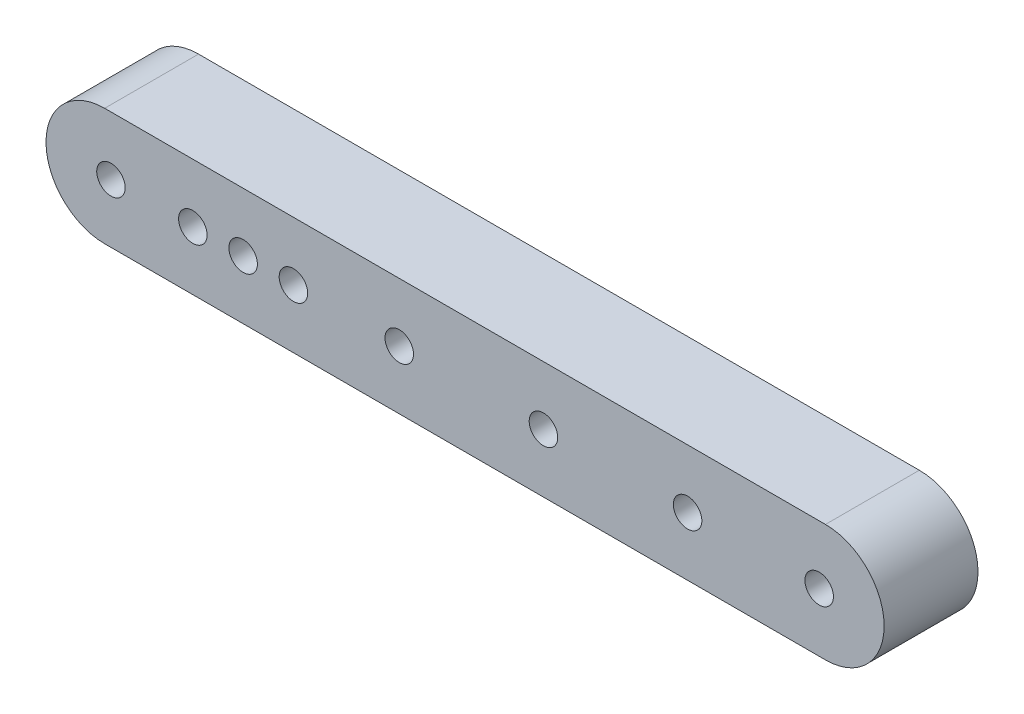
ISO-10303-21;
HEADER;
FILE_DESCRIPTION(('STEP AP214'),'2;1');
FILE_NAME('part.step','',(''),(''),'','','');
FILE_SCHEMA(('AUTOMOTIVE_DESIGN { 1 0 10303 214 1 1 1 1 }'));
ENDSEC;
DATA;
#1=APPLICATION_CONTEXT('core data for automotive mechanical design processes');
#2=APPLICATION_PROTOCOL_DEFINITION('international standard','automotive_design',2000,#1);
#3=PRODUCT_CONTEXT('',#1,'mechanical');
#4=PRODUCT('Part','Part','',(#3));
#5=PRODUCT_RELATED_PRODUCT_CATEGORY('part','',(#4));
#6=PRODUCT_DEFINITION_FORMATION('','',#4);
#7=PRODUCT_DEFINITION_CONTEXT('part definition',#1,'design');
#8=PRODUCT_DEFINITION('design','',#6,#7);
#9=PRODUCT_DEFINITION_SHAPE('','',#8);
#10=(LENGTH_UNIT() NAMED_UNIT(*) SI_UNIT(.MILLI.,.METRE.));
#11=(NAMED_UNIT(*) PLANE_ANGLE_UNIT() SI_UNIT($,.RADIAN.));
#12=(NAMED_UNIT(*) SI_UNIT($,.STERADIAN.) SOLID_ANGLE_UNIT());
#13=UNCERTAINTY_MEASURE_WITH_UNIT(LENGTH_MEASURE(1.E-05),#10,'distance_accuracy_value','');
#14=(GEOMETRIC_REPRESENTATION_CONTEXT(3) GLOBAL_UNCERTAINTY_ASSIGNED_CONTEXT((#13)) GLOBAL_UNIT_ASSIGNED_CONTEXT((#10,
#11,#12)) REPRESENTATION_CONTEXT('',''));
#15=CARTESIAN_POINT('',(0.,0.,0.));
#16=DIRECTION('',(0.,0.,1.));
#17=DIRECTION('',(1.,0.,0.));
#18=AXIS2_PLACEMENT_3D('',#15,#16,#17);
#19=CARTESIAN_POINT('',(-54.8096085409253,0.,-5.6));
#20=DIRECTION('',(0.,0.,1.));
#21=DIRECTION('',(1.,0.,0.));
#22=AXIS2_PLACEMENT_3D('',#19,#20,#21);
#23=CYLINDRICAL_SURFACE('',#22,7.);
#24=DIRECTION('',(0.,0.,1.));
#25=VECTOR('',#24,1.);
#26=CARTESIAN_POINT('',(-54.8096085409253,-7.,-5.6));
#27=LINE('',#26,#25);
#28=CARTESIAN_POINT('',(-54.8096085409253,-7.,-5.6));
#29=VERTEX_POINT('',#28);
#30=CARTESIAN_POINT('',(-54.8096085409253,-7.,5.6));
#31=VERTEX_POINT('',#30);
#32=EDGE_CURVE('E42',#29,#31,#27,.T.);
#33=ORIENTED_EDGE('',*,*,#32,.T.);
#34=CARTESIAN_POINT('',(-54.8096085409253,0.,5.6));
#35=DIRECTION('',(0.,0.,1.));
#36=DIRECTION('',(1.,0.,0.));
#37=AXIS2_PLACEMENT_3D('',#34,#35,#36);
#38=CIRCLE('',#37,7.);
#39=CARTESIAN_POINT('',(-54.8096085409253,7.,5.6));
#40=VERTEX_POINT('',#39);
#41=EDGE_CURVE('E80',#40,#31,#38,.T.);
#42=ORIENTED_EDGE('',*,*,#41,.F.);
#43=DIRECTION('',(0.,0.,1.));
#44=VECTOR('',#43,1.);
#45=CARTESIAN_POINT('',(-54.8096085409253,7.,-5.6));
#46=LINE('',#45,#44);
#47=CARTESIAN_POINT('',(-54.8096085409253,7.,-5.6));
#48=VERTEX_POINT('',#47);
#49=EDGE_CURVE('E11',#48,#40,#46,.T.);
#50=ORIENTED_EDGE('',*,*,#49,.F.);
#51=CARTESIAN_POINT('',(-54.8096085409253,0.,-5.6));
#52=DIRECTION('',(0.,0.,1.));
#53=DIRECTION('',(1.,0.,0.));
#54=AXIS2_PLACEMENT_3D('',#51,#52,#53);
#55=CIRCLE('',#54,7.);
#56=EDGE_CURVE('E81',#48,#29,#55,.T.);
#57=ORIENTED_EDGE('',*,*,#56,.T.);
#58=EDGE_LOOP('',(#33,#42,#50,#57));
#59=FACE_BOUND('',#58,.T.);
#60=ADVANCED_FACE('F39',(#59),#23,.T.);
#61=CARTESIAN_POINT('',(-54.8096085409253,7.,-5.6));
#62=DIRECTION('',(0.,1.,0.));
#63=DIRECTION('',(0.,0.,1.));
#64=AXIS2_PLACEMENT_3D('',#61,#62,#63);
#65=PLANE('',#64);
#66=ORIENTED_EDGE('',*,*,#49,.T.);
#67=DIRECTION('',(-1.,0.,0.));
#68=VECTOR('',#67,1.);
#69=CARTESIAN_POINT('',(-54.8096085409253,7.,5.6));
#70=LINE('',#69,#68);
#71=CARTESIAN_POINT('',(31.1903914590747,7.,5.6));
#72=VERTEX_POINT('',#71);
#73=EDGE_CURVE('E99',#72,#40,#70,.T.);
#74=ORIENTED_EDGE('',*,*,#73,.F.);
#75=DIRECTION('',(0.,0.,1.));
#76=VECTOR('',#75,1.);
#77=CARTESIAN_POINT('',(31.1903914590747,7.,-5.6));
#78=LINE('',#77,#76);
#79=CARTESIAN_POINT('',(31.1903914590747,7.,-5.6));
#80=VERTEX_POINT('',#79);
#81=EDGE_CURVE('E48',#80,#72,#78,.T.);
#82=ORIENTED_EDGE('',*,*,#81,.F.);
#83=DIRECTION('',(-1.,0.,0.));
#84=VECTOR('',#83,1.);
#85=CARTESIAN_POINT('',(-54.8096085409253,7.,-5.6));
#86=LINE('',#85,#84);
#87=EDGE_CURVE('E87',#80,#48,#86,.T.);
#88=ORIENTED_EDGE('',*,*,#87,.T.);
#89=EDGE_LOOP('',(#66,#74,#82,#88));
#90=FACE_BOUND('',#89,.T.);
#91=ADVANCED_FACE('F131',(#90),#65,.T.);
#92=CARTESIAN_POINT('',(31.1903914590747,0.,-5.6));
#93=DIRECTION('',(0.,0.,1.));
#94=DIRECTION('',(1.,0.,0.));
#95=AXIS2_PLACEMENT_3D('',#92,#93,#94);
#96=CYLINDRICAL_SURFACE('',#95,7.);
#97=ORIENTED_EDGE('',*,*,#81,.T.);
#98=CARTESIAN_POINT('',(31.1903914590747,0.,5.6));
#99=DIRECTION('',(0.,0.,1.));
#100=DIRECTION('',(1.,0.,0.));
#101=AXIS2_PLACEMENT_3D('',#98,#99,#100);
#102=CIRCLE('',#101,7.);
#103=CARTESIAN_POINT('',(31.1903914590747,-7.,5.6));
#104=VERTEX_POINT('',#103);
#105=EDGE_CURVE('E95',#104,#72,#102,.T.);
#106=ORIENTED_EDGE('',*,*,#105,.F.);
#107=DIRECTION('',(0.,0.,1.));
#108=VECTOR('',#107,1.);
#109=CARTESIAN_POINT('',(31.1903914590747,-7.,-5.6));
#110=LINE('',#109,#108);
#111=CARTESIAN_POINT('',(31.1903914590747,-7.,-5.6));
#112=VERTEX_POINT('',#111);
#113=EDGE_CURVE('E86',#112,#104,#110,.T.);
#114=ORIENTED_EDGE('',*,*,#113,.F.);
#115=CARTESIAN_POINT('',(31.1903914590747,0.,-5.6));
#116=DIRECTION('',(0.,0.,1.));
#117=DIRECTION('',(1.,0.,0.));
#118=AXIS2_PLACEMENT_3D('',#115,#116,#117);
#119=CIRCLE('',#118,7.);
#120=EDGE_CURVE('E120',#112,#80,#119,.T.);
#121=ORIENTED_EDGE('',*,*,#120,.T.);
#122=EDGE_LOOP('',(#97,#106,#114,#121));
#123=FACE_BOUND('',#122,.T.);
#124=ADVANCED_FACE('F128',(#123),#96,.T.);
#125=CARTESIAN_POINT('',(-54.8096085409253,-7.,-5.6));
#126=DIRECTION('',(0.,-1.,0.));
#127=DIRECTION('',(0.,0.,-1.));
#128=AXIS2_PLACEMENT_3D('',#125,#126,#127);
#129=PLANE('',#128);
#130=ORIENTED_EDGE('',*,*,#113,.T.);
#131=DIRECTION('',(1.,0.,0.));
#132=VECTOR('',#131,1.);
#133=CARTESIAN_POINT('',(-54.8096085409253,-7.,5.6));
#134=LINE('',#133,#132);
#135=EDGE_CURVE('E89',#31,#104,#134,.T.);
#136=ORIENTED_EDGE('',*,*,#135,.F.);
#137=ORIENTED_EDGE('',*,*,#32,.F.);
#138=DIRECTION('',(1.,0.,0.));
#139=VECTOR('',#138,1.);
#140=CARTESIAN_POINT('',(-54.8096085409253,-7.,-5.6));
#141=LINE('',#140,#139);
#142=EDGE_CURVE('E117',#29,#112,#141,.T.);
#143=ORIENTED_EDGE('',*,*,#142,.T.);
#144=EDGE_LOOP('',(#130,#136,#137,#143));
#145=FACE_BOUND('',#144,.T.);
#146=ADVANCED_FACE('F90',(#145),#129,.T.);
#147=CARTESIAN_POINT('',(-54.8096085409253,0.,-5.6));
#148=DIRECTION('',(0.,0.,1.));
#149=DIRECTION('',(1.,0.,0.));
#150=AXIS2_PLACEMENT_3D('',#147,#148,#149);
#151=PLANE('',#150);
#152=CARTESIAN_POINT('',(-54.0596085409253,0.,-5.6));
#153=DIRECTION('',(0.,0.,1.));
#154=DIRECTION('',(1.,0.,0.));
#155=AXIS2_PLACEMENT_3D('',#152,#153,#154);
#156=CIRCLE('',#155,1.7);
#157=CARTESIAN_POINT('',(-52.3596085409253,0.,-5.6));
#158=VERTEX_POINT('',#157);
#159=EDGE_CURVE('E105',#158,#158,#156,.T.);
#160=ORIENTED_EDGE('',*,*,#159,.T.);
#161=EDGE_LOOP('',(#160));
#162=FACE_BOUND('',#161,.T.);
#163=CARTESIAN_POINT('',(-19.6596085409253,0.,-5.6));
#164=DIRECTION('',(0.,0.,1.));
#165=DIRECTION('',(1.,0.,0.));
#166=AXIS2_PLACEMENT_3D('',#163,#164,#165);
#167=CIRCLE('',#166,1.7);
#168=CARTESIAN_POINT('',(-17.9596085409253,0.,-5.6));
#169=VERTEX_POINT('',#168);
#170=EDGE_CURVE('E301',#169,#169,#167,.T.);
#171=ORIENTED_EDGE('',*,*,#170,.T.);
#172=EDGE_LOOP('',(#171));
#173=FACE_BOUND('',#172,.T.);
#174=CARTESIAN_POINT('',(-44.2896085409253,0.,-5.6));
#175=DIRECTION('',(0.,0.,1.));
#176=DIRECTION('',(1.,0.,0.));
#177=AXIS2_PLACEMENT_3D('',#174,#175,#176);
#178=CIRCLE('',#177,1.7);
#179=CARTESIAN_POINT('',(-42.5896085409253,0.,-5.6));
#180=VERTEX_POINT('',#179);
#181=EDGE_CURVE('E319',#180,#180,#178,.T.);
#182=ORIENTED_EDGE('',*,*,#181,.T.);
#183=EDGE_LOOP('',(#182));
#184=FACE_BOUND('',#183,.T.);
#185=CARTESIAN_POINT('',(-32.2896085409253,0.,-5.6));
#186=DIRECTION('',(0.,0.,1.));
#187=DIRECTION('',(1.,0.,0.));
#188=AXIS2_PLACEMENT_3D('',#185,#186,#187);
#189=CIRCLE('',#188,1.7);
#190=CARTESIAN_POINT('',(-30.5896085409253,0.,-5.6));
#191=VERTEX_POINT('',#190);
#192=EDGE_CURVE('E308',#191,#191,#189,.T.);
#193=ORIENTED_EDGE('',*,*,#192,.T.);
#194=EDGE_LOOP('',(#193));
#195=FACE_BOUND('',#194,.T.);
#196=CARTESIAN_POINT('',(-38.2896085409253,0.,-5.6));
#197=DIRECTION('',(0.,0.,1.));
#198=DIRECTION('',(1.,0.,0.));
#199=AXIS2_PLACEMENT_3D('',#196,#197,#198);
#200=CIRCLE('',#199,1.7);
#201=CARTESIAN_POINT('',(-36.5896085409253,0.,-5.6));
#202=VERTEX_POINT('',#201);
#203=EDGE_CURVE('E307',#202,#202,#200,.T.);
#204=ORIENTED_EDGE('',*,*,#203,.T.);
#205=EDGE_LOOP('',(#204));
#206=FACE_BOUND('',#205,.T.);
#207=CARTESIAN_POINT('',(-2.45960854092527,0.,-5.6));
#208=DIRECTION('',(0.,0.,1.));
#209=DIRECTION('',(1.,0.,0.));
#210=AXIS2_PLACEMENT_3D('',#207,#208,#209);
#211=CIRCLE('',#210,1.7);
#212=CARTESIAN_POINT('',(-0.759608540925272,0.,-5.6));
#213=VERTEX_POINT('',#212);
#214=EDGE_CURVE('E297',#213,#213,#211,.T.);
#215=ORIENTED_EDGE('',*,*,#214,.T.);
#216=EDGE_LOOP('',(#215));
#217=FACE_BOUND('',#216,.T.);
#218=CARTESIAN_POINT('',(14.7403914590747,0.,-5.6));
#219=DIRECTION('',(0.,0.,1.));
#220=DIRECTION('',(1.,0.,0.));
#221=AXIS2_PLACEMENT_3D('',#218,#219,#220);
#222=CIRCLE('',#221,1.7);
#223=CARTESIAN_POINT('',(16.4403914590747,0.,-5.6));
#224=VERTEX_POINT('',#223);
#225=EDGE_CURVE('E286',#224,#224,#222,.T.);
#226=ORIENTED_EDGE('',*,*,#225,.T.);
#227=EDGE_LOOP('',(#226));
#228=FACE_BOUND('',#227,.T.);
#229=CARTESIAN_POINT('',(30.4403914590747,0.,-5.6));
#230=DIRECTION('',(0.,0.,1.));
#231=DIRECTION('',(1.,0.,0.));
#232=AXIS2_PLACEMENT_3D('',#229,#230,#231);
#233=CIRCLE('',#232,1.7);
#234=CARTESIAN_POINT('',(32.1403914590747,0.,-5.6));
#235=VERTEX_POINT('',#234);
#236=EDGE_CURVE('E287',#235,#235,#233,.T.);
#237=ORIENTED_EDGE('',*,*,#236,.T.);
#238=EDGE_LOOP('',(#237));
#239=FACE_BOUND('',#238,.T.);
#240=ORIENTED_EDGE('',*,*,#56,.F.);
#241=ORIENTED_EDGE('',*,*,#87,.F.);
#242=ORIENTED_EDGE('',*,*,#120,.F.);
#243=ORIENTED_EDGE('',*,*,#142,.F.);
#244=EDGE_LOOP('',(#240,#241,#242,#243));
#245=FACE_BOUND('',#244,.T.);
#246=ADVANCED_FACE('F133',(#162,#173,#184,#195,#206,#217,#228,#239,#245),#151,.F.);
#247=CARTESIAN_POINT('',(-54.8096085409253,0.,5.6));
#248=DIRECTION('',(0.,0.,1.));
#249=DIRECTION('',(1.,0.,0.));
#250=AXIS2_PLACEMENT_3D('',#247,#248,#249);
#251=PLANE('',#250);
#252=CARTESIAN_POINT('',(-54.0596085409253,0.,5.6));
#253=DIRECTION('',(0.,0.,1.));
#254=DIRECTION('',(1.,0.,0.));
#255=AXIS2_PLACEMENT_3D('',#252,#253,#254);
#256=CIRCLE('',#255,1.7);
#257=CARTESIAN_POINT('',(-52.3596085409253,0.,5.6));
#258=VERTEX_POINT('',#257);
#259=EDGE_CURVE('E101',#258,#258,#256,.T.);
#260=ORIENTED_EDGE('',*,*,#259,.F.);
#261=EDGE_LOOP('',(#260));
#262=FACE_BOUND('',#261,.T.);
#263=CARTESIAN_POINT('',(-19.6596085409253,0.,5.6));
#264=DIRECTION('',(0.,0.,1.));
#265=DIRECTION('',(1.,0.,0.));
#266=AXIS2_PLACEMENT_3D('',#263,#264,#265);
#267=CIRCLE('',#266,1.7);
#268=CARTESIAN_POINT('',(-17.9596085409253,0.,5.6));
#269=VERTEX_POINT('',#268);
#270=EDGE_CURVE('E261',#269,#269,#267,.T.);
#271=ORIENTED_EDGE('',*,*,#270,.F.);
#272=EDGE_LOOP('',(#271));
#273=FACE_BOUND('',#272,.T.);
#274=CARTESIAN_POINT('',(-44.2896085409253,0.,5.6));
#275=DIRECTION('',(0.,0.,1.));
#276=DIRECTION('',(1.,0.,0.));
#277=AXIS2_PLACEMENT_3D('',#274,#275,#276);
#278=CIRCLE('',#277,1.7);
#279=CARTESIAN_POINT('',(-42.5896085409253,0.,5.6));
#280=VERTEX_POINT('',#279);
#281=EDGE_CURVE('E265',#280,#280,#278,.T.);
#282=ORIENTED_EDGE('',*,*,#281,.F.);
#283=EDGE_LOOP('',(#282));
#284=FACE_BOUND('',#283,.T.);
#285=CARTESIAN_POINT('',(-32.2896085409253,0.,5.6));
#286=DIRECTION('',(0.,0.,1.));
#287=DIRECTION('',(1.,0.,0.));
#288=AXIS2_PLACEMENT_3D('',#285,#286,#287);
#289=CIRCLE('',#288,1.7);
#290=CARTESIAN_POINT('',(-30.5896085409253,0.,5.6));
#291=VERTEX_POINT('',#290);
#292=EDGE_CURVE('E269',#291,#291,#289,.T.);
#293=ORIENTED_EDGE('',*,*,#292,.F.);
#294=EDGE_LOOP('',(#293));
#295=FACE_BOUND('',#294,.T.);
#296=CARTESIAN_POINT('',(-38.2896085409253,0.,5.6));
#297=DIRECTION('',(0.,0.,1.));
#298=DIRECTION('',(1.,0.,0.));
#299=AXIS2_PLACEMENT_3D('',#296,#297,#298);
#300=CIRCLE('',#299,1.7);
#301=CARTESIAN_POINT('',(-36.5896085409253,0.,5.6));
#302=VERTEX_POINT('',#301);
#303=EDGE_CURVE('E273',#302,#302,#300,.T.);
#304=ORIENTED_EDGE('',*,*,#303,.F.);
#305=EDGE_LOOP('',(#304));
#306=FACE_BOUND('',#305,.T.);
#307=CARTESIAN_POINT('',(-2.45960854092527,0.,5.6));
#308=DIRECTION('',(0.,0.,1.));
#309=DIRECTION('',(1.,0.,0.));
#310=AXIS2_PLACEMENT_3D('',#307,#308,#309);
#311=CIRCLE('',#310,1.7);
#312=CARTESIAN_POINT('',(-0.759608540925272,0.,5.6));
#313=VERTEX_POINT('',#312);
#314=EDGE_CURVE('E277',#313,#313,#311,.T.);
#315=ORIENTED_EDGE('',*,*,#314,.F.);
#316=EDGE_LOOP('',(#315));
#317=FACE_BOUND('',#316,.T.);
#318=CARTESIAN_POINT('',(14.7403914590747,0.,5.6));
#319=DIRECTION('',(0.,0.,1.));
#320=DIRECTION('',(1.,0.,0.));
#321=AXIS2_PLACEMENT_3D('',#318,#319,#320);
#322=CIRCLE('',#321,1.7);
#323=CARTESIAN_POINT('',(16.4403914590747,0.,5.6));
#324=VERTEX_POINT('',#323);
#325=EDGE_CURVE('E281',#324,#324,#322,.T.);
#326=ORIENTED_EDGE('',*,*,#325,.F.);
#327=EDGE_LOOP('',(#326));
#328=FACE_BOUND('',#327,.T.);
#329=CARTESIAN_POINT('',(30.4403914590747,0.,5.6));
#330=DIRECTION('',(0.,0.,1.));
#331=DIRECTION('',(1.,0.,0.));
#332=AXIS2_PLACEMENT_3D('',#329,#330,#331);
#333=CIRCLE('',#332,1.7);
#334=CARTESIAN_POINT('',(32.1403914590747,0.,5.6));
#335=VERTEX_POINT('',#334);
#336=EDGE_CURVE('E108',#335,#335,#333,.T.);
#337=ORIENTED_EDGE('',*,*,#336,.F.);
#338=EDGE_LOOP('',(#337));
#339=FACE_BOUND('',#338,.T.);
#340=ORIENTED_EDGE('',*,*,#41,.T.);
#341=ORIENTED_EDGE('',*,*,#135,.T.);
#342=ORIENTED_EDGE('',*,*,#105,.T.);
#343=ORIENTED_EDGE('',*,*,#73,.T.);
#344=EDGE_LOOP('',(#340,#341,#342,#343));
#345=FACE_BOUND('',#344,.T.);
#346=ADVANCED_FACE('F98',(#262,#273,#284,#295,#306,#317,#328,#339,#345),#251,.T.);
#347=CARTESIAN_POINT('',(30.4403914590747,0.,10.4083261120685));
#348=DIRECTION('',(0.,0.,-1.));
#349=DIRECTION('',(-1.,0.,0.));
#350=AXIS2_PLACEMENT_3D('',#347,#348,#349);
#351=CYLINDRICAL_SURFACE('',#350,1.7);
#352=ORIENTED_EDGE('',*,*,#236,.F.);
#353=EDGE_LOOP('',(#352));
#354=FACE_BOUND('',#353,.T.);
#355=ORIENTED_EDGE('',*,*,#336,.T.);
#356=EDGE_LOOP('',(#355));
#357=FACE_BOUND('',#356,.T.);
#358=ADVANCED_FACE('F141',(#354,#357),#351,.F.);
#359=CARTESIAN_POINT('',(14.7403914590747,0.,10.4083261120685));
#360=DIRECTION('',(0.,0.,-1.));
#361=DIRECTION('',(-1.,0.,0.));
#362=AXIS2_PLACEMENT_3D('',#359,#360,#361);
#363=CYLINDRICAL_SURFACE('',#362,1.7);
#364=ORIENTED_EDGE('',*,*,#225,.F.);
#365=EDGE_LOOP('',(#364));
#366=FACE_BOUND('',#365,.T.);
#367=ORIENTED_EDGE('',*,*,#325,.T.);
#368=EDGE_LOOP('',(#367));
#369=FACE_BOUND('',#368,.T.);
#370=ADVANCED_FACE('F180',(#366,#369),#363,.F.);
#371=CARTESIAN_POINT('',(-2.45960854092527,0.,10.4083261120685));
#372=DIRECTION('',(0.,0.,-1.));
#373=DIRECTION('',(-1.,0.,0.));
#374=AXIS2_PLACEMENT_3D('',#371,#372,#373);
#375=CYLINDRICAL_SURFACE('',#374,1.7);
#376=ORIENTED_EDGE('',*,*,#214,.F.);
#377=EDGE_LOOP('',(#376));
#378=FACE_BOUND('',#377,.T.);
#379=ORIENTED_EDGE('',*,*,#314,.T.);
#380=EDGE_LOOP('',(#379));
#381=FACE_BOUND('',#380,.T.);
#382=ADVANCED_FACE('F190',(#378,#381),#375,.F.);
#383=CARTESIAN_POINT('',(-38.2896085409253,0.,10.4083261120685));
#384=DIRECTION('',(0.,0.,-1.));
#385=DIRECTION('',(-1.,0.,0.));
#386=AXIS2_PLACEMENT_3D('',#383,#384,#385);
#387=CYLINDRICAL_SURFACE('',#386,1.7);
#388=ORIENTED_EDGE('',*,*,#203,.F.);
#389=EDGE_LOOP('',(#388));
#390=FACE_BOUND('',#389,.T.);
#391=ORIENTED_EDGE('',*,*,#303,.T.);
#392=EDGE_LOOP('',(#391));
#393=FACE_BOUND('',#392,.T.);
#394=ADVANCED_FACE('F200',(#390,#393),#387,.F.);
#395=CARTESIAN_POINT('',(-32.2896085409253,0.,10.4083261120685));
#396=DIRECTION('',(0.,0.,-1.));
#397=DIRECTION('',(-1.,0.,0.));
#398=AXIS2_PLACEMENT_3D('',#395,#396,#397);
#399=CYLINDRICAL_SURFACE('',#398,1.7);
#400=ORIENTED_EDGE('',*,*,#192,.F.);
#401=EDGE_LOOP('',(#400));
#402=FACE_BOUND('',#401,.T.);
#403=ORIENTED_EDGE('',*,*,#292,.T.);
#404=EDGE_LOOP('',(#403));
#405=FACE_BOUND('',#404,.T.);
#406=ADVANCED_FACE('F210',(#402,#405),#399,.F.);
#407=CARTESIAN_POINT('',(-44.2896085409253,0.,10.4083261120685));
#408=DIRECTION('',(0.,0.,-1.));
#409=DIRECTION('',(-1.,0.,0.));
#410=AXIS2_PLACEMENT_3D('',#407,#408,#409);
#411=CYLINDRICAL_SURFACE('',#410,1.7);
#412=ORIENTED_EDGE('',*,*,#181,.F.);
#413=EDGE_LOOP('',(#412));
#414=FACE_BOUND('',#413,.T.);
#415=ORIENTED_EDGE('',*,*,#281,.T.);
#416=EDGE_LOOP('',(#415));
#417=FACE_BOUND('',#416,.T.);
#418=ADVANCED_FACE('F220',(#414,#417),#411,.F.);
#419=CARTESIAN_POINT('',(-19.6596085409253,0.,10.4083261120685));
#420=DIRECTION('',(0.,0.,-1.));
#421=DIRECTION('',(-1.,0.,0.));
#422=AXIS2_PLACEMENT_3D('',#419,#420,#421);
#423=CYLINDRICAL_SURFACE('',#422,1.7);
#424=ORIENTED_EDGE('',*,*,#170,.F.);
#425=EDGE_LOOP('',(#424));
#426=FACE_BOUND('',#425,.T.);
#427=ORIENTED_EDGE('',*,*,#270,.T.);
#428=EDGE_LOOP('',(#427));
#429=FACE_BOUND('',#428,.T.);
#430=ADVANCED_FACE('F230',(#426,#429),#423,.F.);
#431=CARTESIAN_POINT('',(-54.0596085409253,0.,10.4083261120685));
#432=DIRECTION('',(0.,0.,-1.));
#433=DIRECTION('',(-1.,0.,0.));
#434=AXIS2_PLACEMENT_3D('',#431,#432,#433);
#435=CYLINDRICAL_SURFACE('',#434,1.7);
#436=ORIENTED_EDGE('',*,*,#159,.F.);
#437=EDGE_LOOP('',(#436));
#438=FACE_BOUND('',#437,.T.);
#439=ORIENTED_EDGE('',*,*,#259,.T.);
#440=EDGE_LOOP('',(#439));
#441=FACE_BOUND('',#440,.T.);
#442=ADVANCED_FACE('F240',(#438,#441),#435,.F.);
#443=CLOSED_SHELL('',(#60,#91,#124,#146,#246,#346,#358,#370,#382,#394,#406,#418,#430,#442));
#444=MANIFOLD_SOLID_BREP('B2',#443);
#445=ADVANCED_BREP_SHAPE_REPRESENTATION('',(#18,#444),#14);
#446=SHAPE_DEFINITION_REPRESENTATION(#9,#445);
ENDSEC;
END-ISO-10303-21;
